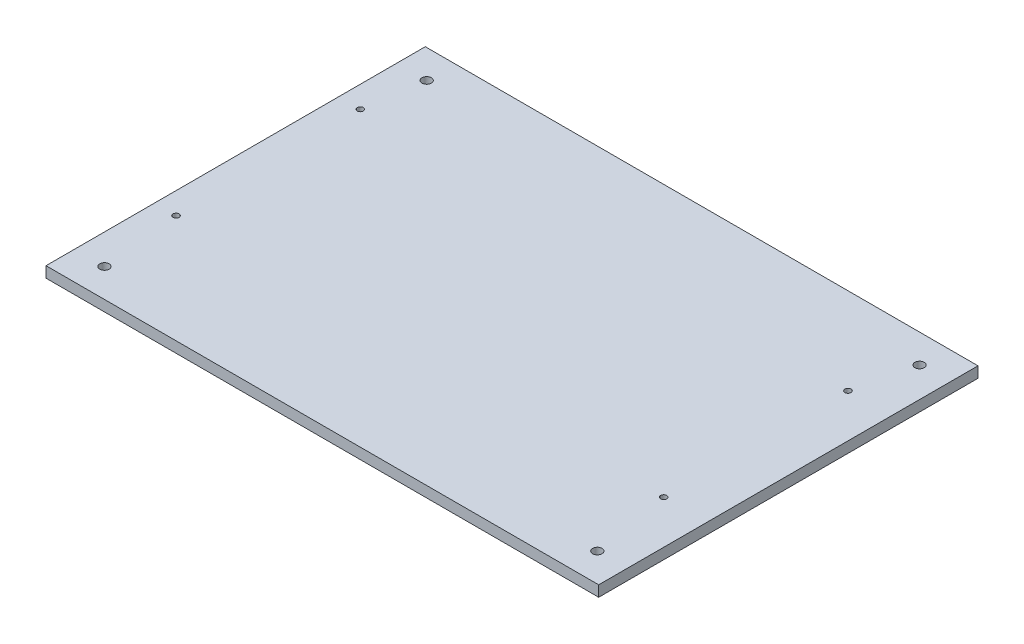
ISO-10303-21;
HEADER;
FILE_DESCRIPTION(('STEP AP214'),'2;1');
FILE_NAME('part.step','',(''),(''),'','','');
FILE_SCHEMA(('AUTOMOTIVE_DESIGN { 1 0 10303 214 1 1 1 1 }'));
ENDSEC;
DATA;
#1=APPLICATION_CONTEXT('core data for automotive mechanical design processes');
#2=APPLICATION_PROTOCOL_DEFINITION('international standard','automotive_design',2000,#1);
#3=PRODUCT_CONTEXT('',#1,'mechanical');
#4=PRODUCT('Part','Part','',(#3));
#5=PRODUCT_RELATED_PRODUCT_CATEGORY('part','',(#4));
#6=PRODUCT_DEFINITION_FORMATION('','',#4);
#7=PRODUCT_DEFINITION_CONTEXT('part definition',#1,'design');
#8=PRODUCT_DEFINITION('design','',#6,#7);
#9=PRODUCT_DEFINITION_SHAPE('','',#8);
#10=(LENGTH_UNIT() NAMED_UNIT(*) SI_UNIT(.MILLI.,.METRE.));
#11=(NAMED_UNIT(*) PLANE_ANGLE_UNIT() SI_UNIT($,.RADIAN.));
#12=(NAMED_UNIT(*) SI_UNIT($,.STERADIAN.) SOLID_ANGLE_UNIT());
#13=UNCERTAINTY_MEASURE_WITH_UNIT(LENGTH_MEASURE(1.E-05),#10,'distance_accuracy_value','');
#14=(GEOMETRIC_REPRESENTATION_CONTEXT(3) GLOBAL_UNCERTAINTY_ASSIGNED_CONTEXT((#13)) GLOBAL_UNIT_ASSIGNED_CONTEXT((#10,
#11,#12)) REPRESENTATION_CONTEXT('',''));
#15=CARTESIAN_POINT('',(0.,0.,0.));
#16=DIRECTION('',(0.,0.,1.));
#17=DIRECTION('',(1.,0.,0.));
#18=AXIS2_PLACEMENT_3D('',#15,#16,#17);
#19=CARTESIAN_POINT('',(161.925,3.175,111.125));
#20=DIRECTION('',(-1.,0.,0.));
#21=DIRECTION('',(0.,0.,1.));
#22=AXIS2_PLACEMENT_3D('',#19,#20,#21);
#23=PLANE('',#22);
#24=DIRECTION('',(0.,0.,-1.));
#25=VECTOR('',#24,1.);
#26=CARTESIAN_POINT('',(161.925,-3.175,111.125));
#27=LINE('',#26,#25);
#28=CARTESIAN_POINT('',(161.925,-3.175,111.125));
#29=VERTEX_POINT('',#28);
#30=CARTESIAN_POINT('',(161.925,-3.175,-111.125));
#31=VERTEX_POINT('',#30);
#32=EDGE_CURVE('E96',#29,#31,#27,.T.);
#33=ORIENTED_EDGE('',*,*,#32,.T.);
#34=DIRECTION('',(0.,-1.,0.));
#35=VECTOR('',#34,1.);
#36=CARTESIAN_POINT('',(161.925,3.175,-111.125));
#37=LINE('',#36,#35);
#38=CARTESIAN_POINT('',(161.925,3.175,-111.125));
#39=VERTEX_POINT('',#38);
#40=EDGE_CURVE('E11',#39,#31,#37,.T.);
#41=ORIENTED_EDGE('',*,*,#40,.F.);
#42=DIRECTION('',(0.,0.,-1.));
#43=VECTOR('',#42,1.);
#44=CARTESIAN_POINT('',(161.925,3.175,111.125));
#45=LINE('',#44,#43);
#46=CARTESIAN_POINT('',(161.925,3.175,111.125));
#47=VERTEX_POINT('',#46);
#48=EDGE_CURVE('E84',#47,#39,#45,.T.);
#49=ORIENTED_EDGE('',*,*,#48,.F.);
#50=DIRECTION('',(0.,-1.,0.));
#51=VECTOR('',#50,1.);
#52=CARTESIAN_POINT('',(161.925,3.175,111.125));
#53=LINE('',#52,#51);
#54=EDGE_CURVE('E92',#47,#29,#53,.T.);
#55=ORIENTED_EDGE('',*,*,#54,.T.);
#56=EDGE_LOOP('',(#33,#41,#49,#55));
#57=FACE_BOUND('',#56,.T.);
#58=ADVANCED_FACE('F33',(#57),#23,.F.);
#59=CARTESIAN_POINT('',(-161.925,3.175,-111.125));
#60=DIRECTION('',(0.,0.,1.));
#61=DIRECTION('',(1.,0.,0.));
#62=AXIS2_PLACEMENT_3D('',#59,#60,#61);
#63=PLANE('',#62);
#64=DIRECTION('',(-1.,0.,0.));
#65=VECTOR('',#64,1.);
#66=CARTESIAN_POINT('',(-161.925,-3.175,-111.125));
#67=LINE('',#66,#65);
#68=CARTESIAN_POINT('',(-161.925,-3.175,-111.125));
#69=VERTEX_POINT('',#68);
#70=EDGE_CURVE('E88',#31,#69,#67,.T.);
#71=ORIENTED_EDGE('',*,*,#70,.T.);
#72=DIRECTION('',(0.,-1.,0.));
#73=VECTOR('',#72,1.);
#74=CARTESIAN_POINT('',(-161.925,3.175,-111.125));
#75=LINE('',#74,#73);
#76=CARTESIAN_POINT('',(-161.925,3.175,-111.125));
#77=VERTEX_POINT('',#76);
#78=EDGE_CURVE('E41',#77,#69,#75,.T.);
#79=ORIENTED_EDGE('',*,*,#78,.F.);
#80=DIRECTION('',(-1.,0.,0.));
#81=VECTOR('',#80,1.);
#82=CARTESIAN_POINT('',(-161.925,3.175,-111.125));
#83=LINE('',#82,#81);
#84=EDGE_CURVE('E79',#39,#77,#83,.T.);
#85=ORIENTED_EDGE('',*,*,#84,.F.);
#86=ORIENTED_EDGE('',*,*,#40,.T.);
#87=EDGE_LOOP('',(#71,#79,#85,#86));
#88=FACE_BOUND('',#87,.T.);
#89=ADVANCED_FACE('F87',(#88),#63,.F.);
#90=CARTESIAN_POINT('',(-161.925,3.175,111.125));
#91=DIRECTION('',(1.,0.,0.));
#92=DIRECTION('',(0.,0.,-1.));
#93=AXIS2_PLACEMENT_3D('',#90,#91,#92);
#94=PLANE('',#93);
#95=DIRECTION('',(0.,0.,1.));
#96=VECTOR('',#95,1.);
#97=CARTESIAN_POINT('',(-161.925,-3.175,111.125));
#98=LINE('',#97,#96);
#99=CARTESIAN_POINT('',(-161.925,-3.175,111.125));
#100=VERTEX_POINT('',#99);
#101=EDGE_CURVE('E66',#69,#100,#98,.T.);
#102=ORIENTED_EDGE('',*,*,#101,.T.);
#103=DIRECTION('',(0.,-1.,0.));
#104=VECTOR('',#103,1.);
#105=CARTESIAN_POINT('',(-161.925,3.175,111.125));
#106=LINE('',#105,#104);
#107=CARTESIAN_POINT('',(-161.925,3.175,111.125));
#108=VERTEX_POINT('',#107);
#109=EDGE_CURVE('E89',#108,#100,#106,.T.);
#110=ORIENTED_EDGE('',*,*,#109,.F.);
#111=DIRECTION('',(0.,0.,1.));
#112=VECTOR('',#111,1.);
#113=CARTESIAN_POINT('',(-161.925,3.175,111.125));
#114=LINE('',#113,#112);
#115=EDGE_CURVE('E82',#77,#108,#114,.T.);
#116=ORIENTED_EDGE('',*,*,#115,.F.);
#117=ORIENTED_EDGE('',*,*,#78,.T.);
#118=EDGE_LOOP('',(#102,#110,#116,#117));
#119=FACE_BOUND('',#118,.T.);
#120=ADVANCED_FACE('F90',(#119),#94,.F.);
#121=CARTESIAN_POINT('',(-161.925,3.175,111.125));
#122=DIRECTION('',(0.,0.,-1.));
#123=DIRECTION('',(-1.,0.,0.));
#124=AXIS2_PLACEMENT_3D('',#121,#122,#123);
#125=PLANE('',#124);
#126=DIRECTION('',(1.,0.,0.));
#127=VECTOR('',#126,1.);
#128=CARTESIAN_POINT('',(-161.925,-3.175,111.125));
#129=LINE('',#128,#127);
#130=EDGE_CURVE('E72',#100,#29,#129,.T.);
#131=ORIENTED_EDGE('',*,*,#130,.T.);
#132=ORIENTED_EDGE('',*,*,#54,.F.);
#133=DIRECTION('',(1.,0.,0.));
#134=VECTOR('',#133,1.);
#135=CARTESIAN_POINT('',(-161.925,3.175,111.125));
#136=LINE('',#135,#134);
#137=EDGE_CURVE('E49',#108,#47,#136,.T.);
#138=ORIENTED_EDGE('',*,*,#137,.F.);
#139=ORIENTED_EDGE('',*,*,#109,.T.);
#140=EDGE_LOOP('',(#131,#132,#138,#139));
#141=FACE_BOUND('',#140,.T.);
#142=ADVANCED_FACE('F104',(#141),#125,.F.);
#143=CARTESIAN_POINT('',(0.,3.175,0.));
#144=DIRECTION('',(0.,-1.,0.));
#145=DIRECTION('',(0.,0.,-1.));
#146=AXIS2_PLACEMENT_3D('',#143,#144,#145);
#147=PLANE('',#146);
#148=CARTESIAN_POINT('',(-149.225,3.175,-60.325));
#149=DIRECTION('',(0.,1.,0.));
#150=DIRECTION('',(0.,0.,1.));
#151=AXIS2_PLACEMENT_3D('',#148,#149,#150);
#152=CIRCLE('',#151,1.78600100000001);
#153=CARTESIAN_POINT('',(-149.225,3.175,-58.538999));
#154=VERTEX_POINT('',#153);
#155=EDGE_CURVE('E154',#154,#154,#152,.T.);
#156=ORIENTED_EDGE('',*,*,#155,.F.);
#157=EDGE_LOOP('',(#156));
#158=FACE_BOUND('',#157,.T.);
#159=CARTESIAN_POINT('',(-149.225,3.175,47.625));
#160=DIRECTION('',(0.,1.,0.));
#161=DIRECTION('',(0.,0.,1.));
#162=AXIS2_PLACEMENT_3D('',#159,#160,#161);
#163=CIRCLE('',#162,1.78600100000001);
#164=CARTESIAN_POINT('',(-149.225,3.175,49.411001));
#165=VERTEX_POINT('',#164);
#166=EDGE_CURVE('E148',#165,#165,#163,.T.);
#167=ORIENTED_EDGE('',*,*,#166,.F.);
#168=EDGE_LOOP('',(#167));
#169=FACE_BOUND('',#168,.T.);
#170=CARTESIAN_POINT('',(136.525,3.175,-60.325));
#171=DIRECTION('',(0.,1.,0.));
#172=DIRECTION('',(0.,0.,1.));
#173=AXIS2_PLACEMENT_3D('',#170,#171,#172);
#174=CIRCLE('',#173,1.78600100000001);
#175=CARTESIAN_POINT('',(136.525,3.175,-58.538999));
#176=VERTEX_POINT('',#175);
#177=EDGE_CURVE('E142',#176,#176,#174,.T.);
#178=ORIENTED_EDGE('',*,*,#177,.F.);
#179=EDGE_LOOP('',(#178));
#180=FACE_BOUND('',#179,.T.);
#181=CARTESIAN_POINT('',(136.525,3.175,47.625));
#182=DIRECTION('',(0.,1.,0.));
#183=DIRECTION('',(0.,0.,1.));
#184=AXIS2_PLACEMENT_3D('',#181,#182,#183);
#185=CIRCLE('',#184,1.78600100000001);
#186=CARTESIAN_POINT('',(136.525,3.175,49.411001));
#187=VERTEX_POINT('',#186);
#188=EDGE_CURVE('E136',#187,#187,#185,.T.);
#189=ORIENTED_EDGE('',*,*,#188,.F.);
#190=EDGE_LOOP('',(#189));
#191=FACE_BOUND('',#190,.T.);
#192=CARTESIAN_POINT('',(-144.399,3.175,-94.3991));
#193=DIRECTION('',(0.,1.,0.));
#194=DIRECTION('',(0.,0.,1.));
#195=AXIS2_PLACEMENT_3D('',#192,#193,#194);
#196=CIRCLE('',#195,2.74999999999997);
#197=CARTESIAN_POINT('',(-144.399,3.175,-91.6491));
#198=VERTEX_POINT('',#197);
#199=EDGE_CURVE('E130',#198,#198,#196,.T.);
#200=ORIENTED_EDGE('',*,*,#199,.F.);
#201=EDGE_LOOP('',(#200));
#202=FACE_BOUND('',#201,.T.);
#203=CARTESIAN_POINT('',(144.399,3.175,-94.3990999999999));
#204=DIRECTION('',(0.,1.,0.));
#205=DIRECTION('',(0.,0.,1.));
#206=AXIS2_PLACEMENT_3D('',#203,#204,#205);
#207=CIRCLE('',#206,2.74999999999997);
#208=CARTESIAN_POINT('',(144.399,3.175,-91.6491));
#209=VERTEX_POINT('',#208);
#210=EDGE_CURVE('E124',#209,#209,#207,.T.);
#211=ORIENTED_EDGE('',*,*,#210,.F.);
#212=EDGE_LOOP('',(#211));
#213=FACE_BOUND('',#212,.T.);
#214=CARTESIAN_POINT('',(144.399,3.175,94.3990999999999));
#215=DIRECTION('',(0.,1.,0.));
#216=DIRECTION('',(0.,0.,1.));
#217=AXIS2_PLACEMENT_3D('',#214,#215,#216);
#218=CIRCLE('',#217,2.74999999999997);
#219=CARTESIAN_POINT('',(144.399,3.175,97.1490999999998));
#220=VERTEX_POINT('',#219);
#221=EDGE_CURVE('E118',#220,#220,#218,.T.);
#222=ORIENTED_EDGE('',*,*,#221,.F.);
#223=EDGE_LOOP('',(#222));
#224=FACE_BOUND('',#223,.T.);
#225=CARTESIAN_POINT('',(-144.399,3.175,94.3991000000001));
#226=DIRECTION('',(0.,1.,0.));
#227=DIRECTION('',(0.,0.,1.));
#228=AXIS2_PLACEMENT_3D('',#225,#226,#227);
#229=CIRCLE('',#228,2.74999999999997);
#230=CARTESIAN_POINT('',(-144.399,3.175,97.1491000000001));
#231=VERTEX_POINT('',#230);
#232=EDGE_CURVE('E112',#231,#231,#229,.T.);
#233=ORIENTED_EDGE('',*,*,#232,.F.);
#234=EDGE_LOOP('',(#233));
#235=FACE_BOUND('',#234,.T.);
#236=ORIENTED_EDGE('',*,*,#48,.T.);
#237=ORIENTED_EDGE('',*,*,#84,.T.);
#238=ORIENTED_EDGE('',*,*,#115,.T.);
#239=ORIENTED_EDGE('',*,*,#137,.T.);
#240=EDGE_LOOP('',(#236,#237,#238,#239));
#241=FACE_BOUND('',#240,.T.);
#242=ADVANCED_FACE('F80',(#158,#169,#180,#191,#202,#213,#224,#235,#241),#147,.F.);
#243=CARTESIAN_POINT('',(0.,-3.175,0.));
#244=DIRECTION('',(0.,-1.,0.));
#245=DIRECTION('',(0.,0.,-1.));
#246=AXIS2_PLACEMENT_3D('',#243,#244,#245);
#247=PLANE('',#246);
#248=CARTESIAN_POINT('',(-149.225,-3.175,-60.325));
#249=DIRECTION('',(0.,1.,0.));
#250=DIRECTION('',(0.,0.,1.));
#251=AXIS2_PLACEMENT_3D('',#248,#249,#250);
#252=CIRCLE('',#251,1.78600100000001);
#253=CARTESIAN_POINT('',(-149.225,-3.175,-58.538999));
#254=VERTEX_POINT('',#253);
#255=EDGE_CURVE('E151',#254,#254,#252,.T.);
#256=ORIENTED_EDGE('',*,*,#255,.T.);
#257=EDGE_LOOP('',(#256));
#258=FACE_BOUND('',#257,.T.);
#259=CARTESIAN_POINT('',(-149.225,-3.175,47.625));
#260=DIRECTION('',(0.,1.,0.));
#261=DIRECTION('',(0.,0.,1.));
#262=AXIS2_PLACEMENT_3D('',#259,#260,#261);
#263=CIRCLE('',#262,1.78600100000001);
#264=CARTESIAN_POINT('',(-149.225,-3.175,49.411001));
#265=VERTEX_POINT('',#264);
#266=EDGE_CURVE('E145',#265,#265,#263,.T.);
#267=ORIENTED_EDGE('',*,*,#266,.T.);
#268=EDGE_LOOP('',(#267));
#269=FACE_BOUND('',#268,.T.);
#270=CARTESIAN_POINT('',(136.525,-3.175,-60.325));
#271=DIRECTION('',(0.,1.,0.));
#272=DIRECTION('',(0.,0.,1.));
#273=AXIS2_PLACEMENT_3D('',#270,#271,#272);
#274=CIRCLE('',#273,1.78600100000001);
#275=CARTESIAN_POINT('',(136.525,-3.175,-58.538999));
#276=VERTEX_POINT('',#275);
#277=EDGE_CURVE('E139',#276,#276,#274,.T.);
#278=ORIENTED_EDGE('',*,*,#277,.T.);
#279=EDGE_LOOP('',(#278));
#280=FACE_BOUND('',#279,.T.);
#281=CARTESIAN_POINT('',(136.525,-3.175,47.625));
#282=DIRECTION('',(0.,1.,0.));
#283=DIRECTION('',(0.,0.,1.));
#284=AXIS2_PLACEMENT_3D('',#281,#282,#283);
#285=CIRCLE('',#284,1.78600100000001);
#286=CARTESIAN_POINT('',(136.525,-3.175,49.411001));
#287=VERTEX_POINT('',#286);
#288=EDGE_CURVE('E133',#287,#287,#285,.T.);
#289=ORIENTED_EDGE('',*,*,#288,.T.);
#290=EDGE_LOOP('',(#289));
#291=FACE_BOUND('',#290,.T.);
#292=CARTESIAN_POINT('',(-144.399,-3.175,-94.3991));
#293=DIRECTION('',(0.,1.,0.));
#294=DIRECTION('',(0.,0.,1.));
#295=AXIS2_PLACEMENT_3D('',#292,#293,#294);
#296=CIRCLE('',#295,2.75);
#297=CARTESIAN_POINT('',(-144.399,-3.175,-91.6491));
#298=VERTEX_POINT('',#297);
#299=EDGE_CURVE('E127',#298,#298,#296,.T.);
#300=ORIENTED_EDGE('',*,*,#299,.T.);
#301=EDGE_LOOP('',(#300));
#302=FACE_BOUND('',#301,.T.);
#303=CARTESIAN_POINT('',(144.399,-3.175,-94.3990999999999));
#304=DIRECTION('',(0.,1.,0.));
#305=DIRECTION('',(0.,0.,1.));
#306=AXIS2_PLACEMENT_3D('',#303,#304,#305);
#307=CIRCLE('',#306,2.75);
#308=CARTESIAN_POINT('',(144.399,-3.175,-91.6490999999999));
#309=VERTEX_POINT('',#308);
#310=EDGE_CURVE('E121',#309,#309,#307,.T.);
#311=ORIENTED_EDGE('',*,*,#310,.T.);
#312=EDGE_LOOP('',(#311));
#313=FACE_BOUND('',#312,.T.);
#314=CARTESIAN_POINT('',(144.399,-3.175,94.3990999999999));
#315=DIRECTION('',(0.,1.,0.));
#316=DIRECTION('',(0.,0.,1.));
#317=AXIS2_PLACEMENT_3D('',#314,#315,#316);
#318=CIRCLE('',#317,2.75);
#319=CARTESIAN_POINT('',(144.399,-3.175,97.1490999999999));
#320=VERTEX_POINT('',#319);
#321=EDGE_CURVE('E115',#320,#320,#318,.T.);
#322=ORIENTED_EDGE('',*,*,#321,.T.);
#323=EDGE_LOOP('',(#322));
#324=FACE_BOUND('',#323,.T.);
#325=CARTESIAN_POINT('',(-144.399,-3.175,94.3991000000001));
#326=DIRECTION('',(0.,1.,0.));
#327=DIRECTION('',(0.,0.,1.));
#328=AXIS2_PLACEMENT_3D('',#325,#326,#327);
#329=CIRCLE('',#328,2.75);
#330=CARTESIAN_POINT('',(-144.399,-3.175,97.1491000000001));
#331=VERTEX_POINT('',#330);
#332=EDGE_CURVE('E99',#331,#331,#329,.T.);
#333=ORIENTED_EDGE('',*,*,#332,.T.);
#334=EDGE_LOOP('',(#333));
#335=FACE_BOUND('',#334,.T.);
#336=ORIENTED_EDGE('',*,*,#32,.F.);
#337=ORIENTED_EDGE('',*,*,#130,.F.);
#338=ORIENTED_EDGE('',*,*,#101,.F.);
#339=ORIENTED_EDGE('',*,*,#70,.F.);
#340=EDGE_LOOP('',(#336,#337,#338,#339));
#341=FACE_BOUND('',#340,.T.);
#342=ADVANCED_FACE('F107',(#258,#269,#280,#291,#302,#313,#324,#335,#341),#247,.T.);
#343=CARTESIAN_POINT('',(-144.399,3.175,94.3991000000001));
#344=DIRECTION('',(0.,1.,0.));
#345=DIRECTION('',(0.,0.,1.));
#346=AXIS2_PLACEMENT_3D('',#343,#344,#345);
#347=CYLINDRICAL_SURFACE('',#346,2.74999999999999);
#348=ORIENTED_EDGE('',*,*,#332,.F.);
#349=EDGE_LOOP('',(#348));
#350=FACE_BOUND('',#349,.T.);
#351=ORIENTED_EDGE('',*,*,#232,.T.);
#352=EDGE_LOOP('',(#351));
#353=FACE_BOUND('',#352,.T.);
#354=ADVANCED_FACE('F177',(#350,#353),#347,.F.);
#355=CARTESIAN_POINT('',(144.399,3.175,94.3990999999999));
#356=DIRECTION('',(0.,1.,0.));
#357=DIRECTION('',(0.,0.,1.));
#358=AXIS2_PLACEMENT_3D('',#355,#356,#357);
#359=CYLINDRICAL_SURFACE('',#358,2.74999999999999);
#360=ORIENTED_EDGE('',*,*,#321,.F.);
#361=EDGE_LOOP('',(#360));
#362=FACE_BOUND('',#361,.T.);
#363=ORIENTED_EDGE('',*,*,#221,.T.);
#364=EDGE_LOOP('',(#363));
#365=FACE_BOUND('',#364,.T.);
#366=ADVANCED_FACE('F179',(#362,#365),#359,.F.);
#367=CARTESIAN_POINT('',(144.399,3.175,-94.3990999999999));
#368=DIRECTION('',(0.,1.,0.));
#369=DIRECTION('',(0.,0.,1.));
#370=AXIS2_PLACEMENT_3D('',#367,#368,#369);
#371=CYLINDRICAL_SURFACE('',#370,2.74999999999999);
#372=ORIENTED_EDGE('',*,*,#310,.F.);
#373=EDGE_LOOP('',(#372));
#374=FACE_BOUND('',#373,.T.);
#375=ORIENTED_EDGE('',*,*,#210,.T.);
#376=EDGE_LOOP('',(#375));
#377=FACE_BOUND('',#376,.T.);
#378=ADVANCED_FACE('F186',(#374,#377),#371,.F.);
#379=CARTESIAN_POINT('',(-144.399,3.175,-94.3991));
#380=DIRECTION('',(0.,1.,0.));
#381=DIRECTION('',(0.,0.,1.));
#382=AXIS2_PLACEMENT_3D('',#379,#380,#381);
#383=CYLINDRICAL_SURFACE('',#382,2.74999999999999);
#384=ORIENTED_EDGE('',*,*,#299,.F.);
#385=EDGE_LOOP('',(#384));
#386=FACE_BOUND('',#385,.T.);
#387=ORIENTED_EDGE('',*,*,#199,.T.);
#388=EDGE_LOOP('',(#387));
#389=FACE_BOUND('',#388,.T.);
#390=ADVANCED_FACE('F229',(#386,#389),#383,.F.);
#391=CARTESIAN_POINT('',(136.525,3.175,47.625));
#392=DIRECTION('',(0.,1.,0.));
#393=DIRECTION('',(0.,0.,1.));
#394=AXIS2_PLACEMENT_3D('',#391,#392,#393);
#395=CYLINDRICAL_SURFACE('',#394,1.78600100000001);
#396=ORIENTED_EDGE('',*,*,#288,.F.);
#397=EDGE_LOOP('',(#396));
#398=FACE_BOUND('',#397,.T.);
#399=ORIENTED_EDGE('',*,*,#188,.T.);
#400=EDGE_LOOP('',(#399));
#401=FACE_BOUND('',#400,.T.);
#402=ADVANCED_FACE('F223',(#398,#401),#395,.F.);
#403=CARTESIAN_POINT('',(136.525,3.175,-60.325));
#404=DIRECTION('',(0.,1.,0.));
#405=DIRECTION('',(0.,0.,1.));
#406=AXIS2_PLACEMENT_3D('',#403,#404,#405);
#407=CYLINDRICAL_SURFACE('',#406,1.78600100000001);
#408=ORIENTED_EDGE('',*,*,#277,.F.);
#409=EDGE_LOOP('',(#408));
#410=FACE_BOUND('',#409,.T.);
#411=ORIENTED_EDGE('',*,*,#177,.T.);
#412=EDGE_LOOP('',(#411));
#413=FACE_BOUND('',#412,.T.);
#414=ADVANCED_FACE('F228',(#410,#413),#407,.F.);
#415=CARTESIAN_POINT('',(-149.225,3.175,47.625));
#416=DIRECTION('',(0.,1.,0.));
#417=DIRECTION('',(0.,0.,1.));
#418=AXIS2_PLACEMENT_3D('',#415,#416,#417);
#419=CYLINDRICAL_SURFACE('',#418,1.78600100000001);
#420=ORIENTED_EDGE('',*,*,#266,.F.);
#421=EDGE_LOOP('',(#420));
#422=FACE_BOUND('',#421,.T.);
#423=ORIENTED_EDGE('',*,*,#166,.T.);
#424=EDGE_LOOP('',(#423));
#425=FACE_BOUND('',#424,.T.);
#426=ADVANCED_FACE('F241',(#422,#425),#419,.F.);
#427=CARTESIAN_POINT('',(-149.225,3.175,-60.325));
#428=DIRECTION('',(0.,1.,0.));
#429=DIRECTION('',(0.,0.,1.));
#430=AXIS2_PLACEMENT_3D('',#427,#428,#429);
#431=CYLINDRICAL_SURFACE('',#430,1.78600100000001);
#432=ORIENTED_EDGE('',*,*,#255,.F.);
#433=EDGE_LOOP('',(#432));
#434=FACE_BOUND('',#433,.T.);
#435=ORIENTED_EDGE('',*,*,#155,.T.);
#436=EDGE_LOOP('',(#435));
#437=FACE_BOUND('',#436,.T.);
#438=ADVANCED_FACE('F158',(#434,#437),#431,.F.);
#439=CLOSED_SHELL('',(#58,#89,#120,#142,#242,#342,#354,#366,#378,#390,#402,#414,#426,#438));
#440=MANIFOLD_SOLID_BREP('B2',#439);
#441=ADVANCED_BREP_SHAPE_REPRESENTATION('',(#18,#440),#14);
#442=SHAPE_DEFINITION_REPRESENTATION(#9,#441);
ENDSEC;
END-ISO-10303-21;
